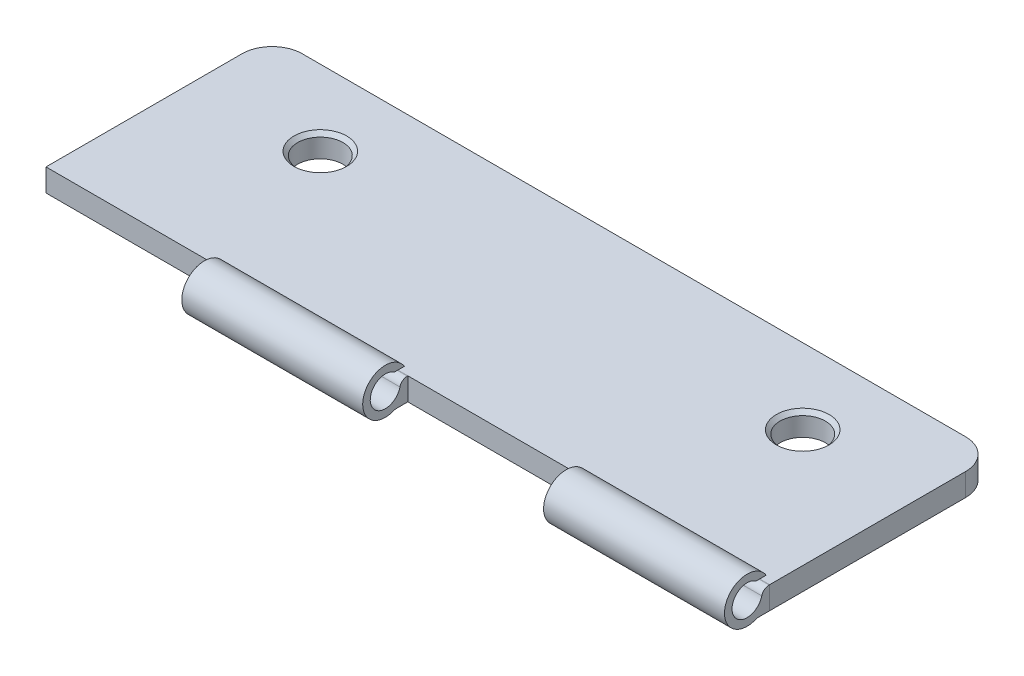
ISO-10303-21;
HEADER;
FILE_DESCRIPTION(('STEP AP214'),'2;1');
FILE_NAME('part.step','',(''),(''),'','','');
FILE_SCHEMA(('AUTOMOTIVE_DESIGN { 1 0 10303 214 1 1 1 1 }'));
ENDSEC;
DATA;
#1=APPLICATION_CONTEXT('core data for automotive mechanical design processes');
#2=APPLICATION_PROTOCOL_DEFINITION('international standard','automotive_design',2000,#1);
#3=PRODUCT_CONTEXT('',#1,'mechanical');
#4=PRODUCT('Part','Part','',(#3));
#5=PRODUCT_RELATED_PRODUCT_CATEGORY('part','',(#4));
#6=PRODUCT_DEFINITION_FORMATION('','',#4);
#7=PRODUCT_DEFINITION_CONTEXT('part definition',#1,'design');
#8=PRODUCT_DEFINITION('design','',#6,#7);
#9=PRODUCT_DEFINITION_SHAPE('','',#8);
#10=(LENGTH_UNIT() NAMED_UNIT(*) SI_UNIT(.MILLI.,.METRE.));
#11=(NAMED_UNIT(*) PLANE_ANGLE_UNIT() SI_UNIT($,.RADIAN.));
#12=(NAMED_UNIT(*) SI_UNIT($,.STERADIAN.) SOLID_ANGLE_UNIT());
#13=UNCERTAINTY_MEASURE_WITH_UNIT(LENGTH_MEASURE(1.E-05),#10,'distance_accuracy_value','');
#14=(GEOMETRIC_REPRESENTATION_CONTEXT(3) GLOBAL_UNCERTAINTY_ASSIGNED_CONTEXT((#13)) GLOBAL_UNIT_ASSIGNED_CONTEXT((#10,
#11,#12)) REPRESENTATION_CONTEXT('',''));
#15=CARTESIAN_POINT('',(0.,0.,0.));
#16=DIRECTION('',(0.,0.,1.));
#17=DIRECTION('',(1.,0.,0.));
#18=AXIS2_PLACEMENT_3D('',#15,#16,#17);
#19=CARTESIAN_POINT('',(-12.,1.5,0.));
#20=DIRECTION('',(0.,1.,0.));
#21=DIRECTION('',(0.,0.,1.));
#22=AXIS2_PLACEMENT_3D('',#19,#20,#21);
#23=PLANE('',#22);
#24=DIRECTION('',(0.,0.,1.));
#25=VECTOR('',#24,1.);
#26=CARTESIAN_POINT('',(0.,1.5,0.));
#27=LINE('',#26,#25);
#28=CARTESIAN_POINT('',(0.,1.5,7.5));
#29=VERTEX_POINT('',#28);
#30=CARTESIAN_POINT('',(0.,1.5,7.53504314649689));
#31=VERTEX_POINT('',#30);
#32=EDGE_CURVE('E152',#29,#31,#27,.T.);
#33=ORIENTED_EDGE('',*,*,#32,.F.);
#34=DIRECTION('',(1.,0.,0.));
#35=VECTOR('',#34,1.);
#36=CARTESIAN_POINT('',(-12.,1.5,7.5));
#37=LINE('',#36,#35);
#38=CARTESIAN_POINT('',(-12.,1.5,7.5));
#39=VERTEX_POINT('',#38);
#40=EDGE_CURVE('E12',#39,#29,#37,.T.);
#41=ORIENTED_EDGE('',*,*,#40,.F.);
#42=DIRECTION('',(0.,0.,1.));
#43=VECTOR('',#42,1.);
#44=CARTESIAN_POINT('',(-12.,1.5,0.));
#45=LINE('',#44,#43);
#46=CARTESIAN_POINT('',(-12.,1.5,7.53504314649689));
#47=VERTEX_POINT('',#46);
#48=EDGE_CURVE('E170',#39,#47,#45,.T.);
#49=ORIENTED_EDGE('',*,*,#48,.T.);
#50=DIRECTION('',(1.,0.,0.));
#51=VECTOR('',#50,1.);
#52=CARTESIAN_POINT('',(-12.,1.5,7.53504314649689));
#53=LINE('',#52,#51);
#54=EDGE_CURVE('E56',#47,#31,#53,.T.);
#55=ORIENTED_EDGE('',*,*,#54,.T.);
#56=EDGE_LOOP('',(#33,#41,#49,#55));
#57=FACE_BOUND('',#56,.T.);
#58=ADVANCED_FACE('F53',(#57),#23,.T.);
#59=CARTESIAN_POINT('',(-12.,0.,7.5));
#60=DIRECTION('',(0.,0.,1.));
#61=DIRECTION('',(1.,0.,0.));
#62=AXIS2_PLACEMENT_3D('',#59,#60,#61);
#63=PLANE('',#62);
#64=DIRECTION('',(0.,-1.,0.));
#65=VECTOR('',#64,1.);
#66=CARTESIAN_POINT('',(0.,0.,7.5));
#67=LINE('',#66,#65);
#68=CARTESIAN_POINT('',(0.,0.,7.5));
#69=VERTEX_POINT('',#68);
#70=EDGE_CURVE('E98',#29,#69,#67,.T.);
#71=ORIENTED_EDGE('',*,*,#70,.T.);
#72=DIRECTION('',(1.,0.,0.));
#73=VECTOR('',#72,1.);
#74=CARTESIAN_POINT('',(-12.,0.,7.5));
#75=LINE('',#74,#73);
#76=CARTESIAN_POINT('',(-12.,0.,7.5));
#77=VERTEX_POINT('',#76);
#78=EDGE_CURVE('E62',#77,#69,#75,.T.);
#79=ORIENTED_EDGE('',*,*,#78,.F.);
#80=DIRECTION('',(0.,-1.,0.));
#81=VECTOR('',#80,1.);
#82=CARTESIAN_POINT('',(-12.,0.,7.5));
#83=LINE('',#82,#81);
#84=EDGE_CURVE('E130',#39,#77,#83,.T.);
#85=ORIENTED_EDGE('',*,*,#84,.F.);
#86=ORIENTED_EDGE('',*,*,#40,.T.);
#87=EDGE_LOOP('',(#71,#79,#85,#86));
#88=FACE_BOUND('',#87,.T.);
#89=ADVANCED_FACE('F207',(#88),#63,.F.);
#90=CARTESIAN_POINT('',(-12.,0.,0.));
#91=DIRECTION('',(0.,1.,0.));
#92=DIRECTION('',(0.,0.,1.));
#93=AXIS2_PLACEMENT_3D('',#90,#91,#92);
#94=PLANE('',#93);
#95=DIRECTION('',(0.,0.,1.));
#96=VECTOR('',#95,1.);
#97=CARTESIAN_POINT('',(0.,0.,0.));
#98=LINE('',#97,#96);
#99=CARTESIAN_POINT('',(0.,0.,8.24121020414949));
#100=VERTEX_POINT('',#99);
#101=EDGE_CURVE('E137',#69,#100,#98,.T.);
#102=ORIENTED_EDGE('',*,*,#101,.T.);
#103=DIRECTION('',(1.,0.,0.));
#104=VECTOR('',#103,1.);
#105=CARTESIAN_POINT('',(-12.,0.,8.24121020414949));
#106=LINE('',#105,#104);
#107=CARTESIAN_POINT('',(-12.,0.,8.24121020414949));
#108=VERTEX_POINT('',#107);
#109=EDGE_CURVE('E134',#108,#100,#106,.T.);
#110=ORIENTED_EDGE('',*,*,#109,.F.);
#111=DIRECTION('',(0.,0.,1.));
#112=VECTOR('',#111,1.);
#113=CARTESIAN_POINT('',(-12.,0.,0.));
#114=LINE('',#113,#112);
#115=EDGE_CURVE('E122',#77,#108,#114,.T.);
#116=ORIENTED_EDGE('',*,*,#115,.F.);
#117=ORIENTED_EDGE('',*,*,#78,.T.);
#118=EDGE_LOOP('',(#102,#110,#116,#117));
#119=FACE_BOUND('',#118,.T.);
#120=ADVANCED_FACE('F135',(#119),#94,.F.);
#121=CARTESIAN_POINT('',(-12.,-0.5,8.24121020414949));
#122=DIRECTION('',(1.,0.,0.));
#123=DIRECTION('',(0.,0.,-1.));
#124=AXIS2_PLACEMENT_3D('',#121,#122,#123);
#125=CYLINDRICAL_SURFACE('',#124,0.5);
#126=CARTESIAN_POINT('',(0.,-0.5,8.24121020414949));
#127=DIRECTION('',(1.,0.,0.));
#128=DIRECTION('',(0.,0.,-1.));
#129=AXIS2_PLACEMENT_3D('',#126,#127,#128);
#130=CIRCLE('',#129,0.5);
#131=CARTESIAN_POINT('',(0.,-0.0366504720669669,8.42911234613897));
#132=VERTEX_POINT('',#131);
#133=EDGE_CURVE('E167',#100,#132,#130,.T.);
#134=ORIENTED_EDGE('',*,*,#133,.T.);
#135=DIRECTION('',(1.,0.,0.));
#136=VECTOR('',#135,1.);
#137=CARTESIAN_POINT('',(-12.,-0.0366504720669669,8.42911234613897));
#138=LINE('',#137,#136);
#139=CARTESIAN_POINT('',(-12.,-0.0366504720669669,8.42911234613897));
#140=VERTEX_POINT('',#139);
#141=EDGE_CURVE('E141',#140,#132,#138,.T.);
#142=ORIENTED_EDGE('',*,*,#141,.F.);
#143=CARTESIAN_POINT('',(-12.,-0.5,8.24121020414949));
#144=DIRECTION('',(1.,0.,0.));
#145=DIRECTION('',(0.,0.,-1.));
#146=AXIS2_PLACEMENT_3D('',#143,#144,#145);
#147=CIRCLE('',#146,0.5);
#148=EDGE_CURVE('E128',#108,#140,#147,.T.);
#149=ORIENTED_EDGE('',*,*,#148,.F.);
#150=ORIENTED_EDGE('',*,*,#109,.T.);
#151=EDGE_LOOP('',(#134,#142,#149,#150));
#152=FACE_BOUND('',#151,.T.);
#153=ADVANCED_FACE('F143',(#152),#125,.F.);
#154=CARTESIAN_POINT('',(-12.,1.35339811173213,8.99281877210742));
#155=DIRECTION('',(1.,0.,0.));
#156=DIRECTION('',(0.,0.,-1.));
#157=AXIS2_PLACEMENT_3D('',#154,#155,#156);
#158=CYLINDRICAL_SURFACE('',#157,1.5);
#159=CARTESIAN_POINT('',(0.,1.35339811173213,8.99281877210742));
#160=DIRECTION('',(1.,0.,0.));
#161=DIRECTION('',(0.,0.,-1.));
#162=AXIS2_PLACEMENT_3D('',#159,#160,#161);
#163=CIRCLE('',#162,1.5);
#164=CARTESIAN_POINT('',(0.,2.15771564337363,7.72669345907788));
#165=VERTEX_POINT('',#164);
#166=EDGE_CURVE('E164',#165,#132,#163,.T.);
#167=ORIENTED_EDGE('',*,*,#166,.F.);
#168=DIRECTION('',(1.,0.,0.));
#169=VECTOR('',#168,1.);
#170=CARTESIAN_POINT('',(-12.,2.15771564337363,7.72669345907788));
#171=LINE('',#170,#169);
#172=CARTESIAN_POINT('',(-12.,2.15771564337363,7.72669345907788));
#173=VERTEX_POINT('',#172);
#174=EDGE_CURVE('E174',#173,#165,#171,.T.);
#175=ORIENTED_EDGE('',*,*,#174,.F.);
#176=CARTESIAN_POINT('',(-12.,1.35339811173213,8.99281877210742));
#177=DIRECTION('',(1.,0.,0.));
#178=DIRECTION('',(0.,0.,-1.));
#179=AXIS2_PLACEMENT_3D('',#176,#177,#178);
#180=CIRCLE('',#179,1.5);
#181=EDGE_CURVE('E145',#173,#140,#180,.T.);
#182=ORIENTED_EDGE('',*,*,#181,.T.);
#183=ORIENTED_EDGE('',*,*,#141,.T.);
#184=EDGE_LOOP('',(#167,#175,#182,#183));
#185=FACE_BOUND('',#184,.T.);
#186=ADVANCED_FACE('F186',(#185),#158,.T.);
#187=CARTESIAN_POINT('',(-12.,2.15771564337362,0.));
#188=DIRECTION('',(0.,-1.,0.));
#189=DIRECTION('',(0.,0.,-1.));
#190=AXIS2_PLACEMENT_3D('',#187,#188,#189);
#191=PLANE('',#190);
#192=DIRECTION('',(0.,0.,-1.));
#193=VECTOR('',#192,1.);
#194=CARTESIAN_POINT('',(0.,2.15771564337362,0.));
#195=LINE('',#194,#193);
#196=CARTESIAN_POINT('',(0.,2.15771564337363,8.3986190512272));
#197=VERTEX_POINT('',#196);
#198=EDGE_CURVE('E161',#197,#165,#195,.T.);
#199=ORIENTED_EDGE('',*,*,#198,.F.);
#200=DIRECTION('',(1.,0.,0.));
#201=VECTOR('',#200,1.);
#202=CARTESIAN_POINT('',(-12.,2.15771564337363,8.3986190512272));
#203=LINE('',#202,#201);
#204=CARTESIAN_POINT('',(-12.,2.15771564337363,8.3986190512272));
#205=VERTEX_POINT('',#204);
#206=EDGE_CURVE('E176',#205,#197,#203,.T.);
#207=ORIENTED_EDGE('',*,*,#206,.F.);
#208=DIRECTION('',(0.,0.,-1.));
#209=VECTOR('',#208,1.);
#210=CARTESIAN_POINT('',(-12.,2.15771564337362,0.));
#211=LINE('',#210,#209);
#212=EDGE_CURVE('E147',#205,#173,#211,.T.);
#213=ORIENTED_EDGE('',*,*,#212,.T.);
#214=ORIENTED_EDGE('',*,*,#174,.T.);
#215=EDGE_LOOP('',(#199,#207,#213,#214));
#216=FACE_BOUND('',#215,.T.);
#217=ADVANCED_FACE('F190',(#216),#191,.T.);
#218=CARTESIAN_POINT('',(-12.,1.35339811173213,8.99281877210742));
#219=DIRECTION('',(1.,0.,0.));
#220=DIRECTION('',(0.,0.,-1.));
#221=AXIS2_PLACEMENT_3D('',#218,#219,#220);
#222=CYLINDRICAL_SURFACE('',#221,1.);
#223=CARTESIAN_POINT('',(0.,1.35339811173213,8.99281877210742));
#224=DIRECTION('',(1.,0.,0.));
#225=DIRECTION('',(0.,0.,-1.));
#226=AXIS2_PLACEMENT_3D('',#223,#224,#225);
#227=CIRCLE('',#226,1.);
#228=CARTESIAN_POINT('',(0.,1.11779937057738,8.02096835503373));
#229=VERTEX_POINT('',#228);
#230=EDGE_CURVE('E158',#197,#229,#227,.T.);
#231=ORIENTED_EDGE('',*,*,#230,.T.);
#232=DIRECTION('',(1.,0.,0.));
#233=VECTOR('',#232,1.);
#234=CARTESIAN_POINT('',(-12.,1.11779937057738,8.02096835503373));
#235=LINE('',#234,#233);
#236=CARTESIAN_POINT('',(-12.,1.11779937057738,8.02096835503373));
#237=VERTEX_POINT('',#236);
#238=EDGE_CURVE('E177',#237,#229,#235,.T.);
#239=ORIENTED_EDGE('',*,*,#238,.F.);
#240=CARTESIAN_POINT('',(-12.,1.35339811173213,8.99281877210742));
#241=DIRECTION('',(1.,0.,0.));
#242=DIRECTION('',(0.,0.,-1.));
#243=AXIS2_PLACEMENT_3D('',#240,#241,#242);
#244=CIRCLE('',#243,1.);
#245=EDGE_CURVE('E192',#205,#237,#244,.T.);
#246=ORIENTED_EDGE('',*,*,#245,.F.);
#247=ORIENTED_EDGE('',*,*,#206,.T.);
#248=EDGE_LOOP('',(#231,#239,#246,#247));
#249=FACE_BOUND('',#248,.T.);
#250=ADVANCED_FACE('F198',(#249),#222,.F.);
#251=CARTESIAN_POINT('',(-12.,1.,7.53504314649689));
#252=DIRECTION('',(1.,0.,0.));
#253=DIRECTION('',(0.,0.,-1.));
#254=AXIS2_PLACEMENT_3D('',#251,#252,#253);
#255=CYLINDRICAL_SURFACE('',#254,0.5);
#256=CARTESIAN_POINT('',(0.,1.,7.53504314649689));
#257=DIRECTION('',(1.,0.,0.));
#258=DIRECTION('',(0.,0.,-1.));
#259=AXIS2_PLACEMENT_3D('',#256,#257,#258);
#260=CIRCLE('',#259,0.5);
#261=EDGE_CURVE('E155',#31,#229,#260,.T.);
#262=ORIENTED_EDGE('',*,*,#261,.F.);
#263=ORIENTED_EDGE('',*,*,#54,.F.);
#264=CARTESIAN_POINT('',(-12.,1.,7.53504314649689));
#265=DIRECTION('',(1.,0.,0.));
#266=DIRECTION('',(0.,0.,-1.));
#267=AXIS2_PLACEMENT_3D('',#264,#265,#266);
#268=CIRCLE('',#267,0.5);
#269=EDGE_CURVE('E193',#47,#237,#268,.T.);
#270=ORIENTED_EDGE('',*,*,#269,.T.);
#271=ORIENTED_EDGE('',*,*,#238,.T.);
#272=EDGE_LOOP('',(#262,#263,#270,#271));
#273=FACE_BOUND('',#272,.T.);
#274=ADVANCED_FACE('F179',(#273),#255,.T.);
#275=CARTESIAN_POINT('',(-12.,0.,0.));
#276=DIRECTION('',(1.,0.,0.));
#277=DIRECTION('',(0.,0.,-1.));
#278=AXIS2_PLACEMENT_3D('',#275,#276,#277);
#279=PLANE('',#278);
#280=ORIENTED_EDGE('',*,*,#48,.F.);
#281=ORIENTED_EDGE('',*,*,#84,.T.);
#282=ORIENTED_EDGE('',*,*,#115,.T.);
#283=ORIENTED_EDGE('',*,*,#148,.T.);
#284=ORIENTED_EDGE('',*,*,#181,.F.);
#285=ORIENTED_EDGE('',*,*,#212,.F.);
#286=ORIENTED_EDGE('',*,*,#245,.T.);
#287=ORIENTED_EDGE('',*,*,#269,.F.);
#288=EDGE_LOOP('',(#280,#281,#282,#283,#284,#285,#286,#287));
#289=FACE_BOUND('',#288,.T.);
#290=ADVANCED_FACE('F125',(#289),#279,.F.);
#291=CARTESIAN_POINT('',(0.,0.,0.));
#292=DIRECTION('',(1.,0.,0.));
#293=DIRECTION('',(0.,0.,-1.));
#294=AXIS2_PLACEMENT_3D('',#291,#292,#293);
#295=PLANE('',#294);
#296=ORIENTED_EDGE('',*,*,#32,.T.);
#297=ORIENTED_EDGE('',*,*,#261,.T.);
#298=ORIENTED_EDGE('',*,*,#230,.F.);
#299=ORIENTED_EDGE('',*,*,#198,.T.);
#300=ORIENTED_EDGE('',*,*,#166,.T.);
#301=ORIENTED_EDGE('',*,*,#133,.F.);
#302=ORIENTED_EDGE('',*,*,#101,.F.);
#303=ORIENTED_EDGE('',*,*,#70,.F.);
#304=EDGE_LOOP('',(#296,#297,#298,#299,#300,#301,#302,#303));
#305=FACE_BOUND('',#304,.T.);
#306=ADVANCED_FACE('F182',(#305),#295,.T.);
#307=CLOSED_SHELL('',(#58,#89,#120,#153,#186,#217,#250,#274,#290,#306));
#308=MANIFOLD_SOLID_BREP('B2',#307);
#309=CARTESIAN_POINT('',(12.,1.5,0.));
#310=DIRECTION('',(0.,1.,0.));
#311=DIRECTION('',(0.,0.,1.));
#312=AXIS2_PLACEMENT_3D('',#309,#310,#311);
#313=PLANE('',#312);
#314=DIRECTION('',(0.,0.,1.));
#315=VECTOR('',#314,1.);
#316=CARTESIAN_POINT('',(24.,1.5,0.));
#317=LINE('',#316,#315);
#318=CARTESIAN_POINT('',(24.,1.5,7.5));
#319=VERTEX_POINT('',#318);
#320=CARTESIAN_POINT('',(24.,1.5,7.53504314649689));
#321=VERTEX_POINT('',#320);
#322=EDGE_CURVE('E425',#319,#321,#317,.T.);
#323=ORIENTED_EDGE('',*,*,#322,.F.);
#324=DIRECTION('',(1.,0.,0.));
#325=VECTOR('',#324,1.);
#326=CARTESIAN_POINT('',(12.,1.5,7.5));
#327=LINE('',#326,#325);
#328=CARTESIAN_POINT('',(12.,1.5,7.5));
#329=VERTEX_POINT('',#328);
#330=EDGE_CURVE('E51',#329,#319,#327,.T.);
#331=ORIENTED_EDGE('',*,*,#330,.F.);
#332=DIRECTION('',(0.,0.,1.));
#333=VECTOR('',#332,1.);
#334=CARTESIAN_POINT('',(12.,1.5,0.));
#335=LINE('',#334,#333);
#336=CARTESIAN_POINT('',(12.,1.5,7.53504314649689));
#337=VERTEX_POINT('',#336);
#338=EDGE_CURVE('E443',#329,#337,#335,.T.);
#339=ORIENTED_EDGE('',*,*,#338,.T.);
#340=DIRECTION('',(1.,0.,0.));
#341=VECTOR('',#340,1.);
#342=CARTESIAN_POINT('',(12.,1.5,7.53504314649689));
#343=LINE('',#342,#341);
#344=EDGE_CURVE('E329',#337,#321,#343,.T.);
#345=ORIENTED_EDGE('',*,*,#344,.T.);
#346=EDGE_LOOP('',(#323,#331,#339,#345));
#347=FACE_BOUND('',#346,.T.);
#348=ADVANCED_FACE('F326',(#347),#313,.T.);
#349=CARTESIAN_POINT('',(12.,0.,7.5));
#350=DIRECTION('',(0.,0.,1.));
#351=DIRECTION('',(1.,0.,0.));
#352=AXIS2_PLACEMENT_3D('',#349,#350,#351);
#353=PLANE('',#352);
#354=DIRECTION('',(0.,-1.,0.));
#355=VECTOR('',#354,1.);
#356=CARTESIAN_POINT('',(24.,0.,7.5));
#357=LINE('',#356,#355);
#358=CARTESIAN_POINT('',(24.,0.,7.5));
#359=VERTEX_POINT('',#358);
#360=EDGE_CURVE('E371',#319,#359,#357,.T.);
#361=ORIENTED_EDGE('',*,*,#360,.T.);
#362=DIRECTION('',(1.,0.,0.));
#363=VECTOR('',#362,1.);
#364=CARTESIAN_POINT('',(12.,0.,7.5));
#365=LINE('',#364,#363);
#366=CARTESIAN_POINT('',(12.,0.,7.5));
#367=VERTEX_POINT('',#366);
#368=EDGE_CURVE('E335',#367,#359,#365,.T.);
#369=ORIENTED_EDGE('',*,*,#368,.F.);
#370=DIRECTION('',(0.,-1.,0.));
#371=VECTOR('',#370,1.);
#372=CARTESIAN_POINT('',(12.,0.,7.5));
#373=LINE('',#372,#371);
#374=EDGE_CURVE('E403',#329,#367,#373,.T.);
#375=ORIENTED_EDGE('',*,*,#374,.F.);
#376=ORIENTED_EDGE('',*,*,#330,.T.);
#377=EDGE_LOOP('',(#361,#369,#375,#376));
#378=FACE_BOUND('',#377,.T.);
#379=ADVANCED_FACE('F480',(#378),#353,.F.);
#380=CARTESIAN_POINT('',(12.,0.,0.));
#381=DIRECTION('',(0.,1.,0.));
#382=DIRECTION('',(0.,0.,1.));
#383=AXIS2_PLACEMENT_3D('',#380,#381,#382);
#384=PLANE('',#383);
#385=DIRECTION('',(0.,0.,1.));
#386=VECTOR('',#385,1.);
#387=CARTESIAN_POINT('',(24.,0.,0.));
#388=LINE('',#387,#386);
#389=CARTESIAN_POINT('',(24.,0.,8.24121020414949));
#390=VERTEX_POINT('',#389);
#391=EDGE_CURVE('E410',#359,#390,#388,.T.);
#392=ORIENTED_EDGE('',*,*,#391,.T.);
#393=DIRECTION('',(1.,0.,0.));
#394=VECTOR('',#393,1.);
#395=CARTESIAN_POINT('',(12.,0.,8.24121020414949));
#396=LINE('',#395,#394);
#397=CARTESIAN_POINT('',(12.,0.,8.24121020414949));
#398=VERTEX_POINT('',#397);
#399=EDGE_CURVE('E407',#398,#390,#396,.T.);
#400=ORIENTED_EDGE('',*,*,#399,.F.);
#401=DIRECTION('',(0.,0.,1.));
#402=VECTOR('',#401,1.);
#403=CARTESIAN_POINT('',(12.,0.,0.));
#404=LINE('',#403,#402);
#405=EDGE_CURVE('E395',#367,#398,#404,.T.);
#406=ORIENTED_EDGE('',*,*,#405,.F.);
#407=ORIENTED_EDGE('',*,*,#368,.T.);
#408=EDGE_LOOP('',(#392,#400,#406,#407));
#409=FACE_BOUND('',#408,.T.);
#410=ADVANCED_FACE('F408',(#409),#384,.F.);
#411=CARTESIAN_POINT('',(12.,-0.5,8.24121020414949));
#412=DIRECTION('',(1.,0.,0.));
#413=DIRECTION('',(0.,0.,-1.));
#414=AXIS2_PLACEMENT_3D('',#411,#412,#413);
#415=CYLINDRICAL_SURFACE('',#414,0.5);
#416=CARTESIAN_POINT('',(24.,-0.5,8.24121020414949));
#417=DIRECTION('',(1.,0.,0.));
#418=DIRECTION('',(0.,0.,-1.));
#419=AXIS2_PLACEMENT_3D('',#416,#417,#418);
#420=CIRCLE('',#419,0.5);
#421=CARTESIAN_POINT('',(24.,-0.0366504720669669,8.42911234613897));
#422=VERTEX_POINT('',#421);
#423=EDGE_CURVE('E440',#390,#422,#420,.T.);
#424=ORIENTED_EDGE('',*,*,#423,.T.);
#425=DIRECTION('',(1.,0.,0.));
#426=VECTOR('',#425,1.);
#427=CARTESIAN_POINT('',(12.,-0.0366504720669669,8.42911234613897));
#428=LINE('',#427,#426);
#429=CARTESIAN_POINT('',(12.,-0.0366504720669669,8.42911234613897));
#430=VERTEX_POINT('',#429);
#431=EDGE_CURVE('E414',#430,#422,#428,.T.);
#432=ORIENTED_EDGE('',*,*,#431,.F.);
#433=CARTESIAN_POINT('',(12.,-0.5,8.24121020414949));
#434=DIRECTION('',(1.,0.,0.));
#435=DIRECTION('',(0.,0.,-1.));
#436=AXIS2_PLACEMENT_3D('',#433,#434,#435);
#437=CIRCLE('',#436,0.5);
#438=EDGE_CURVE('E401',#398,#430,#437,.T.);
#439=ORIENTED_EDGE('',*,*,#438,.F.);
#440=ORIENTED_EDGE('',*,*,#399,.T.);
#441=EDGE_LOOP('',(#424,#432,#439,#440));
#442=FACE_BOUND('',#441,.T.);
#443=ADVANCED_FACE('F416',(#442),#415,.F.);
#444=CARTESIAN_POINT('',(12.,1.35339811173213,8.99281877210742));
#445=DIRECTION('',(1.,0.,0.));
#446=DIRECTION('',(0.,0.,-1.));
#447=AXIS2_PLACEMENT_3D('',#444,#445,#446);
#448=CYLINDRICAL_SURFACE('',#447,1.5);
#449=CARTESIAN_POINT('',(24.,1.35339811173213,8.99281877210742));
#450=DIRECTION('',(1.,0.,0.));
#451=DIRECTION('',(0.,0.,-1.));
#452=AXIS2_PLACEMENT_3D('',#449,#450,#451);
#453=CIRCLE('',#452,1.5);
#454=CARTESIAN_POINT('',(24.,2.15771564337363,7.72669345907788));
#455=VERTEX_POINT('',#454);
#456=EDGE_CURVE('E437',#455,#422,#453,.T.);
#457=ORIENTED_EDGE('',*,*,#456,.F.);
#458=DIRECTION('',(1.,0.,0.));
#459=VECTOR('',#458,1.);
#460=CARTESIAN_POINT('',(12.,2.15771564337363,7.72669345907788));
#461=LINE('',#460,#459);
#462=CARTESIAN_POINT('',(12.,2.15771564337363,7.72669345907788));
#463=VERTEX_POINT('',#462);
#464=EDGE_CURVE('E447',#463,#455,#461,.T.);
#465=ORIENTED_EDGE('',*,*,#464,.F.);
#466=CARTESIAN_POINT('',(12.,1.35339811173213,8.99281877210742));
#467=DIRECTION('',(1.,0.,0.));
#468=DIRECTION('',(0.,0.,-1.));
#469=AXIS2_PLACEMENT_3D('',#466,#467,#468);
#470=CIRCLE('',#469,1.5);
#471=EDGE_CURVE('E418',#463,#430,#470,.T.);
#472=ORIENTED_EDGE('',*,*,#471,.T.);
#473=ORIENTED_EDGE('',*,*,#431,.T.);
#474=EDGE_LOOP('',(#457,#465,#472,#473));
#475=FACE_BOUND('',#474,.T.);
#476=ADVANCED_FACE('F459',(#475),#448,.T.);
#477=CARTESIAN_POINT('',(12.,2.15771564337362,0.));
#478=DIRECTION('',(0.,-1.,0.));
#479=DIRECTION('',(0.,0.,-1.));
#480=AXIS2_PLACEMENT_3D('',#477,#478,#479);
#481=PLANE('',#480);
#482=DIRECTION('',(0.,0.,-1.));
#483=VECTOR('',#482,1.);
#484=CARTESIAN_POINT('',(24.,2.15771564337362,0.));
#485=LINE('',#484,#483);
#486=CARTESIAN_POINT('',(24.,2.15771564337363,8.3986190512272));
#487=VERTEX_POINT('',#486);
#488=EDGE_CURVE('E434',#487,#455,#485,.T.);
#489=ORIENTED_EDGE('',*,*,#488,.F.);
#490=DIRECTION('',(1.,0.,0.));
#491=VECTOR('',#490,1.);
#492=CARTESIAN_POINT('',(12.,2.15771564337363,8.3986190512272));
#493=LINE('',#492,#491);
#494=CARTESIAN_POINT('',(12.,2.15771564337363,8.3986190512272));
#495=VERTEX_POINT('',#494);
#496=EDGE_CURVE('E449',#495,#487,#493,.T.);
#497=ORIENTED_EDGE('',*,*,#496,.F.);
#498=DIRECTION('',(0.,0.,-1.));
#499=VECTOR('',#498,1.);
#500=CARTESIAN_POINT('',(12.,2.15771564337362,0.));
#501=LINE('',#500,#499);
#502=EDGE_CURVE('E420',#495,#463,#501,.T.);
#503=ORIENTED_EDGE('',*,*,#502,.T.);
#504=ORIENTED_EDGE('',*,*,#464,.T.);
#505=EDGE_LOOP('',(#489,#497,#503,#504));
#506=FACE_BOUND('',#505,.T.);
#507=ADVANCED_FACE('F463',(#506),#481,.T.);
#508=CARTESIAN_POINT('',(12.,1.35339811173213,8.99281877210742));
#509=DIRECTION('',(1.,0.,0.));
#510=DIRECTION('',(0.,0.,-1.));
#511=AXIS2_PLACEMENT_3D('',#508,#509,#510);
#512=CYLINDRICAL_SURFACE('',#511,1.);
#513=CARTESIAN_POINT('',(24.,1.35339811173213,8.99281877210742));
#514=DIRECTION('',(1.,0.,0.));
#515=DIRECTION('',(0.,0.,-1.));
#516=AXIS2_PLACEMENT_3D('',#513,#514,#515);
#517=CIRCLE('',#516,1.);
#518=CARTESIAN_POINT('',(24.,1.11779937057738,8.02096835503373));
#519=VERTEX_POINT('',#518);
#520=EDGE_CURVE('E431',#487,#519,#517,.T.);
#521=ORIENTED_EDGE('',*,*,#520,.T.);
#522=DIRECTION('',(1.,0.,0.));
#523=VECTOR('',#522,1.);
#524=CARTESIAN_POINT('',(12.,1.11779937057738,8.02096835503373));
#525=LINE('',#524,#523);
#526=CARTESIAN_POINT('',(12.,1.11779937057738,8.02096835503373));
#527=VERTEX_POINT('',#526);
#528=EDGE_CURVE('E450',#527,#519,#525,.T.);
#529=ORIENTED_EDGE('',*,*,#528,.F.);
#530=CARTESIAN_POINT('',(12.,1.35339811173213,8.99281877210742));
#531=DIRECTION('',(1.,0.,0.));
#532=DIRECTION('',(0.,0.,-1.));
#533=AXIS2_PLACEMENT_3D('',#530,#531,#532);
#534=CIRCLE('',#533,1.);
#535=EDGE_CURVE('E465',#495,#527,#534,.T.);
#536=ORIENTED_EDGE('',*,*,#535,.F.);
#537=ORIENTED_EDGE('',*,*,#496,.T.);
#538=EDGE_LOOP('',(#521,#529,#536,#537));
#539=FACE_BOUND('',#538,.T.);
#540=ADVANCED_FACE('F471',(#539),#512,.F.);
#541=CARTESIAN_POINT('',(12.,1.,7.53504314649689));
#542=DIRECTION('',(1.,0.,0.));
#543=DIRECTION('',(0.,0.,-1.));
#544=AXIS2_PLACEMENT_3D('',#541,#542,#543);
#545=CYLINDRICAL_SURFACE('',#544,0.5);
#546=CARTESIAN_POINT('',(24.,1.,7.53504314649689));
#547=DIRECTION('',(1.,0.,0.));
#548=DIRECTION('',(0.,0.,-1.));
#549=AXIS2_PLACEMENT_3D('',#546,#547,#548);
#550=CIRCLE('',#549,0.5);
#551=EDGE_CURVE('E428',#321,#519,#550,.T.);
#552=ORIENTED_EDGE('',*,*,#551,.F.);
#553=ORIENTED_EDGE('',*,*,#344,.F.);
#554=CARTESIAN_POINT('',(12.,1.,7.53504314649689));
#555=DIRECTION('',(1.,0.,0.));
#556=DIRECTION('',(0.,0.,-1.));
#557=AXIS2_PLACEMENT_3D('',#554,#555,#556);
#558=CIRCLE('',#557,0.5);
#559=EDGE_CURVE('E466',#337,#527,#558,.T.);
#560=ORIENTED_EDGE('',*,*,#559,.T.);
#561=ORIENTED_EDGE('',*,*,#528,.T.);
#562=EDGE_LOOP('',(#552,#553,#560,#561));
#563=FACE_BOUND('',#562,.T.);
#564=ADVANCED_FACE('F452',(#563),#545,.T.);
#565=CARTESIAN_POINT('',(12.,0.,0.));
#566=DIRECTION('',(1.,0.,0.));
#567=DIRECTION('',(0.,0.,-1.));
#568=AXIS2_PLACEMENT_3D('',#565,#566,#567);
#569=PLANE('',#568);
#570=ORIENTED_EDGE('',*,*,#338,.F.);
#571=ORIENTED_EDGE('',*,*,#374,.T.);
#572=ORIENTED_EDGE('',*,*,#405,.T.);
#573=ORIENTED_EDGE('',*,*,#438,.T.);
#574=ORIENTED_EDGE('',*,*,#471,.F.);
#575=ORIENTED_EDGE('',*,*,#502,.F.);
#576=ORIENTED_EDGE('',*,*,#535,.T.);
#577=ORIENTED_EDGE('',*,*,#559,.F.);
#578=EDGE_LOOP('',(#570,#571,#572,#573,#574,#575,#576,#577));
#579=FACE_BOUND('',#578,.T.);
#580=ADVANCED_FACE('F398',(#579),#569,.F.);
#581=CARTESIAN_POINT('',(24.,0.,0.));
#582=DIRECTION('',(1.,0.,0.));
#583=DIRECTION('',(0.,0.,-1.));
#584=AXIS2_PLACEMENT_3D('',#581,#582,#583);
#585=PLANE('',#584);
#586=ORIENTED_EDGE('',*,*,#322,.T.);
#587=ORIENTED_EDGE('',*,*,#551,.T.);
#588=ORIENTED_EDGE('',*,*,#520,.F.);
#589=ORIENTED_EDGE('',*,*,#488,.T.);
#590=ORIENTED_EDGE('',*,*,#456,.T.);
#591=ORIENTED_EDGE('',*,*,#423,.F.);
#592=ORIENTED_EDGE('',*,*,#391,.F.);
#593=ORIENTED_EDGE('',*,*,#360,.F.);
#594=EDGE_LOOP('',(#586,#587,#588,#589,#590,#591,#592,#593));
#595=FACE_BOUND('',#594,.T.);
#596=ADVANCED_FACE('F455',(#595),#585,.T.);
#597=CLOSED_SHELL('',(#348,#379,#410,#443,#476,#507,#540,#564,#580,#596));
#598=MANIFOLD_SOLID_BREP('B6',#597);
#599=CARTESIAN_POINT('',(-22.,1.5,-5.5));
#600=DIRECTION('',(0.,-1.,0.));
#601=DIRECTION('',(0.,0.,-1.));
#602=AXIS2_PLACEMENT_3D('',#599,#600,#601);
#603=PLANE('',#602);
#604=CARTESIAN_POINT('',(16.1965193707209,1.5,-2.5));
#605=DIRECTION('',(0.,-1.,0.));
#606=DIRECTION('',(0.,0.,-1.));
#607=AXIS2_PLACEMENT_3D('',#604,#605,#606);
#608=CIRCLE('',#607,1.75);
#609=CARTESIAN_POINT('',(16.1965193707209,1.5,-4.25));
#610=VERTEX_POINT('',#609);
#611=EDGE_CURVE('E566',#610,#610,#608,.T.);
#612=ORIENTED_EDGE('',*,*,#611,.T.);
#613=EDGE_LOOP('',(#612));
#614=FACE_BOUND('',#613,.T.);
#615=CARTESIAN_POINT('',(-15.8034806292791,1.5,-2.5));
#616=DIRECTION('',(0.,-1.,0.));
#617=DIRECTION('',(0.,0.,-1.));
#618=AXIS2_PLACEMENT_3D('',#615,#616,#617);
#619=CIRCLE('',#618,1.75);
#620=CARTESIAN_POINT('',(-15.8034806292791,1.5,-4.25));
#621=VERTEX_POINT('',#620);
#622=EDGE_CURVE('E665',#621,#621,#619,.T.);
#623=ORIENTED_EDGE('',*,*,#622,.T.);
#624=EDGE_LOOP('',(#623));
#625=FACE_BOUND('',#624,.T.);
#626=DIRECTION('',(0.,0.,1.));
#627=VECTOR('',#626,1.);
#628=CARTESIAN_POINT('',(-24.,1.5,7.5));
#629=LINE('',#628,#627);
#630=CARTESIAN_POINT('',(-24.,1.5,-5.5));
#631=VERTEX_POINT('',#630);
#632=CARTESIAN_POINT('',(-24.,1.5,7.5));
#633=VERTEX_POINT('',#632);
#634=EDGE_CURVE('E653',#631,#633,#629,.T.);
#635=ORIENTED_EDGE('',*,*,#634,.T.);
#636=DIRECTION('',(1.,0.,0.));
#637=VECTOR('',#636,1.);
#638=CARTESIAN_POINT('',(-24.,1.5,7.5));
#639=LINE('',#638,#637);
#640=CARTESIAN_POINT('',(24.,1.5,7.5));
#641=VERTEX_POINT('',#640);
#642=EDGE_CURVE('E612',#633,#641,#639,.T.);
#643=ORIENTED_EDGE('',*,*,#642,.T.);
#644=DIRECTION('',(0.,0.,-1.));
#645=VECTOR('',#644,1.);
#646=CARTESIAN_POINT('',(24.,1.5,7.5));
#647=LINE('',#646,#645);
#648=CARTESIAN_POINT('',(24.,1.5,-5.5));
#649=VERTEX_POINT('',#648);
#650=EDGE_CURVE('E624',#641,#649,#647,.T.);
#651=ORIENTED_EDGE('',*,*,#650,.T.);
#652=CARTESIAN_POINT('',(22.,1.5,-5.5));
#653=DIRECTION('',(0.,1.,0.));
#654=DIRECTION('',(0.,0.,-1.));
#655=AXIS2_PLACEMENT_3D('',#652,#653,#654);
#656=CIRCLE('',#655,2.);
#657=CARTESIAN_POINT('',(22.,1.5,-7.5));
#658=VERTEX_POINT('',#657);
#659=EDGE_CURVE('E619',#649,#658,#656,.T.);
#660=ORIENTED_EDGE('',*,*,#659,.T.);
#661=DIRECTION('',(-1.,0.,0.));
#662=VECTOR('',#661,1.);
#663=CARTESIAN_POINT('',(-22.,1.5,-7.5));
#664=LINE('',#663,#662);
#665=CARTESIAN_POINT('',(-22.,1.5,-7.5));
#666=VERTEX_POINT('',#665);
#667=EDGE_CURVE('E622',#658,#666,#664,.T.);
#668=ORIENTED_EDGE('',*,*,#667,.T.);
#669=CARTESIAN_POINT('',(-22.,1.5,-5.5));
#670=DIRECTION('',(0.,1.,0.));
#671=DIRECTION('',(0.,0.,-1.));
#672=AXIS2_PLACEMENT_3D('',#669,#670,#671);
#673=CIRCLE('',#672,2.);
#674=EDGE_CURVE('E574',#666,#631,#673,.T.);
#675=ORIENTED_EDGE('',*,*,#674,.T.);
#676=EDGE_LOOP('',(#635,#643,#651,#660,#668,#675));
#677=FACE_BOUND('',#676,.T.);
#678=ADVANCED_FACE('F556',(#614,#625,#677),#603,.F.);
#679=CARTESIAN_POINT('',(-22.,0.,-5.5));
#680=DIRECTION('',(0.,-1.,0.));
#681=DIRECTION('',(0.,0.,-1.));
#682=AXIS2_PLACEMENT_3D('',#679,#680,#681);
#683=PLANE('',#682);
#684=CARTESIAN_POINT('',(-15.8034806292791,0.,-2.5));
#685=DIRECTION('',(0.,1.,0.));
#686=DIRECTION('',(0.,0.,1.));
#687=AXIS2_PLACEMENT_3D('',#684,#685,#686);
#688=CIRCLE('',#687,1.5);
#689=CARTESIAN_POINT('',(-15.8034806292791,0.,-0.999999999999998));
#690=VERTEX_POINT('',#689);
#691=EDGE_CURVE('E646',#690,#690,#688,.T.);
#692=ORIENTED_EDGE('',*,*,#691,.T.);
#693=EDGE_LOOP('',(#692));
#694=FACE_BOUND('',#693,.T.);
#695=DIRECTION('',(0.,0.,1.));
#696=VECTOR('',#695,1.);
#697=CARTESIAN_POINT('',(-24.,0.,7.5));
#698=LINE('',#697,#696);
#699=CARTESIAN_POINT('',(-24.,0.,-5.5));
#700=VERTEX_POINT('',#699);
#701=CARTESIAN_POINT('',(-24.,0.,7.5));
#702=VERTEX_POINT('',#701);
#703=EDGE_CURVE('E642',#700,#702,#698,.T.);
#704=ORIENTED_EDGE('',*,*,#703,.F.);
#705=CARTESIAN_POINT('',(-22.,0.,-5.5));
#706=DIRECTION('',(0.,1.,0.));
#707=DIRECTION('',(0.,0.,-1.));
#708=AXIS2_PLACEMENT_3D('',#705,#706,#707);
#709=CIRCLE('',#708,2.);
#710=CARTESIAN_POINT('',(-22.,0.,-7.5));
#711=VERTEX_POINT('',#710);
#712=EDGE_CURVE('E603',#711,#700,#709,.T.);
#713=ORIENTED_EDGE('',*,*,#712,.F.);
#714=DIRECTION('',(-1.,0.,0.));
#715=VECTOR('',#714,1.);
#716=CARTESIAN_POINT('',(-22.,0.,-7.5));
#717=LINE('',#716,#715);
#718=CARTESIAN_POINT('',(22.,0.,-7.5));
#719=VERTEX_POINT('',#718);
#720=EDGE_CURVE('E597',#719,#711,#717,.T.);
#721=ORIENTED_EDGE('',*,*,#720,.F.);
#722=CARTESIAN_POINT('',(22.,0.,-5.5));
#723=DIRECTION('',(0.,1.,0.));
#724=DIRECTION('',(0.,0.,-1.));
#725=AXIS2_PLACEMENT_3D('',#722,#723,#724);
#726=CIRCLE('',#725,2.);
#727=CARTESIAN_POINT('',(24.,0.,-5.5));
#728=VERTEX_POINT('',#727);
#729=EDGE_CURVE('E632',#728,#719,#726,.T.);
#730=ORIENTED_EDGE('',*,*,#729,.F.);
#731=DIRECTION('',(0.,0.,-1.));
#732=VECTOR('',#731,1.);
#733=CARTESIAN_POINT('',(24.,0.,7.5));
#734=LINE('',#733,#732);
#735=CARTESIAN_POINT('',(24.,0.,7.5));
#736=VERTEX_POINT('',#735);
#737=EDGE_CURVE('E648',#736,#728,#734,.T.);
#738=ORIENTED_EDGE('',*,*,#737,.F.);
#739=DIRECTION('',(1.,0.,0.));
#740=VECTOR('',#739,1.);
#741=CARTESIAN_POINT('',(-24.,0.,7.5));
#742=LINE('',#741,#740);
#743=EDGE_CURVE('E645',#702,#736,#742,.T.);
#744=ORIENTED_EDGE('',*,*,#743,.F.);
#745=EDGE_LOOP('',(#704,#713,#721,#730,#738,#744));
#746=FACE_BOUND('',#745,.T.);
#747=CARTESIAN_POINT('',(16.1965193707209,0.,-2.5));
#748=DIRECTION('',(0.,1.,0.));
#749=DIRECTION('',(0.,0.,1.));
#750=AXIS2_PLACEMENT_3D('',#747,#748,#749);
#751=CIRCLE('',#750,1.5);
#752=CARTESIAN_POINT('',(16.1965193707209,0.,-0.999999999999998));
#753=VERTEX_POINT('',#752);
#754=EDGE_CURVE('E684',#753,#753,#751,.T.);
#755=ORIENTED_EDGE('',*,*,#754,.T.);
#756=EDGE_LOOP('',(#755));
#757=FACE_BOUND('',#756,.T.);
#758=ADVANCED_FACE('F699',(#694,#746,#757),#683,.T.);
#759=CARTESIAN_POINT('',(-24.,1.5,7.5));
#760=DIRECTION('',(1.,0.,0.));
#761=DIRECTION('',(0.,0.,-1.));
#762=AXIS2_PLACEMENT_3D('',#759,#760,#761);
#763=PLANE('',#762);
#764=ORIENTED_EDGE('',*,*,#703,.T.);
#765=DIRECTION('',(0.,-1.,0.));
#766=VECTOR('',#765,1.);
#767=CARTESIAN_POINT('',(-24.,1.5,7.5));
#768=LINE('',#767,#766);
#769=EDGE_CURVE('E660',#633,#702,#768,.T.);
#770=ORIENTED_EDGE('',*,*,#769,.F.);
#771=ORIENTED_EDGE('',*,*,#634,.F.);
#772=DIRECTION('',(0.,-1.,0.));
#773=VECTOR('',#772,1.);
#774=CARTESIAN_POINT('',(-24.,1.5,-5.5));
#775=LINE('',#774,#773);
#776=EDGE_CURVE('E638',#631,#700,#775,.T.);
#777=ORIENTED_EDGE('',*,*,#776,.T.);
#778=EDGE_LOOP('',(#764,#770,#771,#777));
#779=FACE_BOUND('',#778,.T.);
#780=ADVANCED_FACE('F701',(#779),#763,.F.);
#781=CARTESIAN_POINT('',(-24.,1.5,7.5));
#782=DIRECTION('',(0.,0.,-1.));
#783=DIRECTION('',(-1.,0.,0.));
#784=AXIS2_PLACEMENT_3D('',#781,#782,#783);
#785=PLANE('',#784);
#786=ORIENTED_EDGE('',*,*,#743,.T.);
#787=DIRECTION('',(0.,-1.,0.));
#788=VECTOR('',#787,1.);
#789=CARTESIAN_POINT('',(24.,1.5,7.5));
#790=LINE('',#789,#788);
#791=EDGE_CURVE('E657',#641,#736,#790,.T.);
#792=ORIENTED_EDGE('',*,*,#791,.F.);
#793=ORIENTED_EDGE('',*,*,#642,.F.);
#794=ORIENTED_EDGE('',*,*,#769,.T.);
#795=EDGE_LOOP('',(#786,#792,#793,#794));
#796=FACE_BOUND('',#795,.T.);
#797=ADVANCED_FACE('F693',(#796),#785,.F.);
#798=CARTESIAN_POINT('',(24.,1.5,7.5));
#799=DIRECTION('',(-1.,0.,0.));
#800=DIRECTION('',(0.,0.,1.));
#801=AXIS2_PLACEMENT_3D('',#798,#799,#800);
#802=PLANE('',#801);
#803=ORIENTED_EDGE('',*,*,#737,.T.);
#804=DIRECTION('',(0.,-1.,0.));
#805=VECTOR('',#804,1.);
#806=CARTESIAN_POINT('',(24.,1.5,-5.5));
#807=LINE('',#806,#805);
#808=EDGE_CURVE('E633',#649,#728,#807,.T.);
#809=ORIENTED_EDGE('',*,*,#808,.F.);
#810=ORIENTED_EDGE('',*,*,#650,.F.);
#811=ORIENTED_EDGE('',*,*,#791,.T.);
#812=EDGE_LOOP('',(#803,#809,#810,#811));
#813=FACE_BOUND('',#812,.T.);
#814=ADVANCED_FACE('F696',(#813),#802,.F.);
#815=CARTESIAN_POINT('',(22.,1.5,-5.5));
#816=DIRECTION('',(0.,-1.,0.));
#817=DIRECTION('',(0.,0.,-1.));
#818=AXIS2_PLACEMENT_3D('',#815,#816,#817);
#819=CYLINDRICAL_SURFACE('',#818,2.);
#820=ORIENTED_EDGE('',*,*,#729,.T.);
#821=DIRECTION('',(0.,-1.,0.));
#822=VECTOR('',#821,1.);
#823=CARTESIAN_POINT('',(22.,1.5,-7.5));
#824=LINE('',#823,#822);
#825=EDGE_CURVE('E629',#658,#719,#824,.T.);
#826=ORIENTED_EDGE('',*,*,#825,.F.);
#827=ORIENTED_EDGE('',*,*,#659,.F.);
#828=ORIENTED_EDGE('',*,*,#808,.T.);
#829=EDGE_LOOP('',(#820,#826,#827,#828));
#830=FACE_BOUND('',#829,.T.);
#831=ADVANCED_FACE('F630',(#830),#819,.T.);
#832=CARTESIAN_POINT('',(-22.,1.5,-7.5));
#833=DIRECTION('',(0.,0.,1.));
#834=DIRECTION('',(1.,0.,0.));
#835=AXIS2_PLACEMENT_3D('',#832,#833,#834);
#836=PLANE('',#835);
#837=ORIENTED_EDGE('',*,*,#720,.T.);
#838=DIRECTION('',(0.,-1.,0.));
#839=VECTOR('',#838,1.);
#840=CARTESIAN_POINT('',(-22.,1.5,-7.5));
#841=LINE('',#840,#839);
#842=EDGE_CURVE('E634',#666,#711,#841,.T.);
#843=ORIENTED_EDGE('',*,*,#842,.F.);
#844=ORIENTED_EDGE('',*,*,#667,.F.);
#845=ORIENTED_EDGE('',*,*,#825,.T.);
#846=EDGE_LOOP('',(#837,#843,#844,#845));
#847=FACE_BOUND('',#846,.T.);
#848=ADVANCED_FACE('F636',(#847),#836,.F.);
#849=CARTESIAN_POINT('',(-22.,1.5,-5.5));
#850=DIRECTION('',(0.,-1.,0.));
#851=DIRECTION('',(0.,0.,-1.));
#852=AXIS2_PLACEMENT_3D('',#849,#850,#851);
#853=CYLINDRICAL_SURFACE('',#852,2.);
#854=ORIENTED_EDGE('',*,*,#712,.T.);
#855=ORIENTED_EDGE('',*,*,#776,.F.);
#856=ORIENTED_EDGE('',*,*,#674,.F.);
#857=ORIENTED_EDGE('',*,*,#842,.T.);
#858=EDGE_LOOP('',(#854,#855,#856,#857));
#859=FACE_BOUND('',#858,.T.);
#860=ADVANCED_FACE('F702',(#859),#853,.T.);
#861=CARTESIAN_POINT('',(-15.8034806292791,1.5,-2.5));
#862=DIRECTION('',(0.,-1.,0.));
#863=DIRECTION('',(0.,0.,-1.));
#864=AXIS2_PLACEMENT_3D('',#861,#862,#863);
#865=CYLINDRICAL_SURFACE('',#864,1.5);
#866=CARTESIAN_POINT('',(-15.8034806292791,1.25,-2.5));
#867=DIRECTION('',(0.,-1.,0.));
#868=DIRECTION('',(0.,0.,-1.));
#869=AXIS2_PLACEMENT_3D('',#866,#867,#868);
#870=CIRCLE('',#869,1.5);
#871=CARTESIAN_POINT('',(-15.8034806292791,1.25,-4.));
#872=VERTEX_POINT('',#871);
#873=EDGE_CURVE('E324',#872,#872,#870,.F.);
#874=ORIENTED_EDGE('',*,*,#873,.T.);
#875=EDGE_LOOP('',(#874));
#876=FACE_BOUND('',#875,.T.);
#877=ORIENTED_EDGE('',*,*,#691,.F.);
#878=EDGE_LOOP('',(#877));
#879=FACE_BOUND('',#878,.T.);
#880=ADVANCED_FACE('F680',(#876,#879),#865,.F.);
#881=CARTESIAN_POINT('',(16.1965193707209,1.5,-2.5));
#882=DIRECTION('',(0.,-1.,0.));
#883=DIRECTION('',(0.,0.,-1.));
#884=AXIS2_PLACEMENT_3D('',#881,#882,#883);
#885=CYLINDRICAL_SURFACE('',#884,1.5);
#886=CARTESIAN_POINT('',(16.1965193707209,1.25,-2.5));
#887=DIRECTION('',(0.,-1.,0.));
#888=DIRECTION('',(0.,0.,-1.));
#889=AXIS2_PLACEMENT_3D('',#886,#887,#888);
#890=CIRCLE('',#889,1.5);
#891=CARTESIAN_POINT('',(16.1965193707209,1.25,-4.));
#892=VERTEX_POINT('',#891);
#893=EDGE_CURVE('E662',#892,#892,#890,.F.);
#894=ORIENTED_EDGE('',*,*,#893,.T.);
#895=EDGE_LOOP('',(#894));
#896=FACE_BOUND('',#895,.T.);
#897=ORIENTED_EDGE('',*,*,#754,.F.);
#898=EDGE_LOOP('',(#897));
#899=FACE_BOUND('',#898,.T.);
#900=ADVANCED_FACE('F675',(#896,#899),#885,.F.);
#901=CARTESIAN_POINT('',(16.1965193707209,1.25,-2.5));
#902=DIRECTION('',(0.,1.,0.));
#903=DIRECTION('',(0.,0.,1.));
#904=AXIS2_PLACEMENT_3D('',#901,#902,#903);
#905=CONICAL_SURFACE('',#904,1.5,0.785398163397452);
#906=ORIENTED_EDGE('',*,*,#611,.F.);
#907=EDGE_LOOP('',(#906));
#908=FACE_BOUND('',#907,.T.);
#909=ORIENTED_EDGE('',*,*,#893,.F.);
#910=EDGE_LOOP('',(#909));
#911=FACE_BOUND('',#910,.T.);
#912=ADVANCED_FACE('F672',(#908,#911),#905,.F.);
#913=CARTESIAN_POINT('',(-15.8034806292791,1.25,-2.5));
#914=DIRECTION('',(0.,1.,0.));
#915=DIRECTION('',(0.,0.,1.));
#916=AXIS2_PLACEMENT_3D('',#913,#914,#915);
#917=CONICAL_SURFACE('',#916,1.5,0.785398163397452);
#918=ORIENTED_EDGE('',*,*,#622,.F.);
#919=EDGE_LOOP('',(#918));
#920=FACE_BOUND('',#919,.T.);
#921=ORIENTED_EDGE('',*,*,#873,.F.);
#922=EDGE_LOOP('',(#921));
#923=FACE_BOUND('',#922,.T.);
#924=ADVANCED_FACE('F559',(#920,#923),#917,.F.);
#925=CLOSED_SHELL('',(#678,#758,#780,#797,#814,#831,#848,#860,#880,#900,#912,#924));
#926=MANIFOLD_SOLID_BREP('B45',#925);
#927=ADVANCED_BREP_SHAPE_REPRESENTATION('',(#18,#308,#598,#926),#14);
#928=SHAPE_DEFINITION_REPRESENTATION(#9,#927);
ENDSEC;
END-ISO-10303-21;
